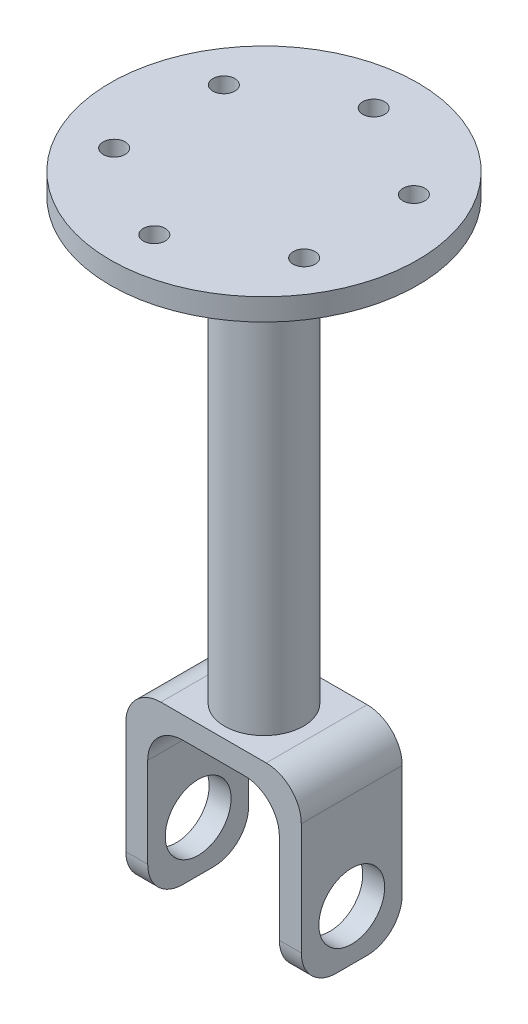
ISO-10303-21;
HEADER;
FILE_DESCRIPTION(('STEP AP214'),'2;1');
FILE_NAME('part.step','',(''),(''),'','','');
FILE_SCHEMA(('AUTOMOTIVE_DESIGN { 1 0 10303 214 1 1 1 1 }'));
ENDSEC;
DATA;
#1=APPLICATION_CONTEXT('core data for automotive mechanical design processes');
#2=APPLICATION_PROTOCOL_DEFINITION('international standard','automotive_design',2000,#1);
#3=PRODUCT_CONTEXT('',#1,'mechanical');
#4=PRODUCT('Part','Part','',(#3));
#5=PRODUCT_RELATED_PRODUCT_CATEGORY('part','',(#4));
#6=PRODUCT_DEFINITION_FORMATION('','',#4);
#7=PRODUCT_DEFINITION_CONTEXT('part definition',#1,'design');
#8=PRODUCT_DEFINITION('design','',#6,#7);
#9=PRODUCT_DEFINITION_SHAPE('','',#8);
#10=(LENGTH_UNIT() NAMED_UNIT(*) SI_UNIT(.MILLI.,.METRE.));
#11=(NAMED_UNIT(*) PLANE_ANGLE_UNIT() SI_UNIT($,.RADIAN.));
#12=(NAMED_UNIT(*) SI_UNIT($,.STERADIAN.) SOLID_ANGLE_UNIT());
#13=UNCERTAINTY_MEASURE_WITH_UNIT(LENGTH_MEASURE(1.E-05),#10,'distance_accuracy_value','');
#14=(GEOMETRIC_REPRESENTATION_CONTEXT(3) GLOBAL_UNCERTAINTY_ASSIGNED_CONTEXT((#13)) GLOBAL_UNIT_ASSIGNED_CONTEXT((#10,
#11,#12)) REPRESENTATION_CONTEXT('',''));
#15=CARTESIAN_POINT('',(0.,0.,0.));
#16=DIRECTION('',(0.,0.,1.));
#17=DIRECTION('',(1.,0.,0.));
#18=AXIS2_PLACEMENT_3D('',#15,#16,#17);
#19=CARTESIAN_POINT('',(20.,813.5,-11.5));
#20=DIRECTION('',(-1.,0.,0.));
#21=DIRECTION('',(0.,0.,1.));
#22=AXIS2_PLACEMENT_3D('',#19,#20,#21);
#23=PLANE('',#22);
#24=CARTESIAN_POINT('',(20.,825.,0.));
#25=DIRECTION('',(-1.,0.,0.));
#26=DIRECTION('',(0.,0.,1.));
#27=AXIS2_PLACEMENT_3D('',#24,#25,#26);
#28=CIRCLE('',#27,7.49999999999996);
#29=CARTESIAN_POINT('',(20.,825.,7.49999999999995));
#30=VERTEX_POINT('',#29);
#31=EDGE_CURVE('E344',#30,#30,#28,.T.);
#32=ORIENTED_EDGE('',*,*,#31,.T.);
#33=EDGE_LOOP('',(#32));
#34=FACE_BOUND('',#33,.T.);
#35=DIRECTION('',(0.,-1.,0.));
#36=VECTOR('',#35,1.);
#37=CARTESIAN_POINT('',(20.,813.5,-11.5));
#38=LINE('',#37,#36);
#39=CARTESIAN_POINT('',(20.,847.,-11.5));
#40=VERTEX_POINT('',#39);
#41=CARTESIAN_POINT('',(20.,821.5,-11.5));
#42=VERTEX_POINT('',#41);
#43=EDGE_CURVE('E174',#40,#42,#38,.T.);
#44=ORIENTED_EDGE('',*,*,#43,.F.);
#45=DIRECTION('',(0.,0.,1.));
#46=VECTOR('',#45,1.);
#47=CARTESIAN_POINT('',(20.,847.,-11.5));
#48=LINE('',#47,#46);
#49=CARTESIAN_POINT('',(20.,847.,11.5));
#50=VERTEX_POINT('',#49);
#51=EDGE_CURVE('E159',#40,#50,#48,.T.);
#52=ORIENTED_EDGE('',*,*,#51,.T.);
#53=DIRECTION('',(0.,-1.,0.));
#54=VECTOR('',#53,1.);
#55=CARTESIAN_POINT('',(20.,813.5,11.5));
#56=LINE('',#55,#54);
#57=CARTESIAN_POINT('',(20.,821.5,11.5));
#58=VERTEX_POINT('',#57);
#59=EDGE_CURVE('E171',#50,#58,#56,.T.);
#60=ORIENTED_EDGE('',*,*,#59,.T.);
#61=CARTESIAN_POINT('',(20.,821.5,3.5));
#62=DIRECTION('',(-1.,0.,0.));
#63=DIRECTION('',(0.,0.,1.));
#64=AXIS2_PLACEMENT_3D('',#61,#62,#63);
#65=CIRCLE('',#64,8.);
#66=CARTESIAN_POINT('',(20.,813.5,3.5));
#67=VERTEX_POINT('',#66);
#68=EDGE_CURVE('E176',#58,#67,#65,.F.);
#69=ORIENTED_EDGE('',*,*,#68,.T.);
#70=DIRECTION('',(0.,0.,1.));
#71=VECTOR('',#70,1.);
#72=CARTESIAN_POINT('',(20.,813.5,-11.5));
#73=LINE('',#72,#71);
#74=CARTESIAN_POINT('',(20.,813.5,-3.5));
#75=VERTEX_POINT('',#74);
#76=EDGE_CURVE('E212',#75,#67,#73,.T.);
#77=ORIENTED_EDGE('',*,*,#76,.F.);
#78=CARTESIAN_POINT('',(20.,821.5,-3.5));
#79=DIRECTION('',(-1.,0.,0.));
#80=DIRECTION('',(0.,0.,1.));
#81=AXIS2_PLACEMENT_3D('',#78,#79,#80);
#82=CIRCLE('',#81,8.);
#83=EDGE_CURVE('E216',#75,#42,#82,.F.);
#84=ORIENTED_EDGE('',*,*,#83,.T.);
#85=EDGE_LOOP('',(#44,#52,#60,#69,#77,#84));
#86=FACE_BOUND('',#85,.T.);
#87=ADVANCED_FACE('F41',(#34,#86),#23,.F.);
#88=CARTESIAN_POINT('',(20.,813.5,-11.5));
#89=DIRECTION('',(0.,1.,0.));
#90=DIRECTION('',(0.,0.,1.));
#91=AXIS2_PLACEMENT_3D('',#88,#89,#90);
#92=PLANE('',#91);
#93=ORIENTED_EDGE('',*,*,#76,.T.);
#94=DIRECTION('',(-1.,0.,0.));
#95=VECTOR('',#94,1.);
#96=CARTESIAN_POINT('',(15.,813.5,3.5));
#97=LINE('',#96,#95);
#98=CARTESIAN_POINT('',(15.,813.5,3.5));
#99=VERTEX_POINT('',#98);
#100=EDGE_CURVE('E256',#67,#99,#97,.T.);
#101=ORIENTED_EDGE('',*,*,#100,.T.);
#102=DIRECTION('',(0.,0.,1.));
#103=VECTOR('',#102,1.);
#104=CARTESIAN_POINT('',(15.,813.5,-11.5));
#105=LINE('',#104,#103);
#106=CARTESIAN_POINT('',(15.,813.5,-3.5));
#107=VERTEX_POINT('',#106);
#108=EDGE_CURVE('E209',#107,#99,#105,.T.);
#109=ORIENTED_EDGE('',*,*,#108,.F.);
#110=DIRECTION('',(-1.,0.,0.));
#111=VECTOR('',#110,1.);
#112=CARTESIAN_POINT('',(20.,813.5,-3.5));
#113=LINE('',#112,#111);
#114=EDGE_CURVE('E254',#107,#75,#113,.F.);
#115=ORIENTED_EDGE('',*,*,#114,.T.);
#116=EDGE_LOOP('',(#93,#101,#109,#115));
#117=FACE_BOUND('',#116,.T.);
#118=ADVANCED_FACE('F392',(#117),#92,.F.);
#119=CARTESIAN_POINT('',(15.,813.5,-11.5));
#120=DIRECTION('',(1.,0.,0.));
#121=DIRECTION('',(0.,0.,-1.));
#122=AXIS2_PLACEMENT_3D('',#119,#120,#121);
#123=PLANE('',#122);
#124=CARTESIAN_POINT('',(15.,825.,0.));
#125=DIRECTION('',(1.,0.,0.));
#126=DIRECTION('',(0.,0.,-1.));
#127=AXIS2_PLACEMENT_3D('',#124,#125,#126);
#128=CIRCLE('',#127,7.49999999999996);
#129=CARTESIAN_POINT('',(15.,825.,-7.49999999999996));
#130=VERTEX_POINT('',#129);
#131=EDGE_CURVE('E349',#130,#130,#128,.T.);
#132=ORIENTED_EDGE('',*,*,#131,.T.);
#133=EDGE_LOOP('',(#132));
#134=FACE_BOUND('',#133,.T.);
#135=DIRECTION('',(0.,1.,0.));
#136=VECTOR('',#135,1.);
#137=CARTESIAN_POINT('',(15.,813.5,11.5));
#138=LINE('',#137,#136);
#139=CARTESIAN_POINT('',(15.,821.5,11.5));
#140=VERTEX_POINT('',#139);
#141=CARTESIAN_POINT('',(15.,842.,11.5));
#142=VERTEX_POINT('',#141);
#143=EDGE_CURVE('E181',#140,#142,#138,.T.);
#144=ORIENTED_EDGE('',*,*,#143,.T.);
#145=DIRECTION('',(0.,0.,1.));
#146=VECTOR('',#145,1.);
#147=CARTESIAN_POINT('',(15.,842.,-11.5));
#148=LINE('',#147,#146);
#149=CARTESIAN_POINT('',(15.,842.,-11.5));
#150=VERTEX_POINT('',#149);
#151=EDGE_CURVE('E245',#142,#150,#148,.F.);
#152=ORIENTED_EDGE('',*,*,#151,.T.);
#153=DIRECTION('',(0.,1.,0.));
#154=VECTOR('',#153,1.);
#155=CARTESIAN_POINT('',(15.,813.5,-11.5));
#156=LINE('',#155,#154);
#157=CARTESIAN_POINT('',(15.,821.5,-11.5));
#158=VERTEX_POINT('',#157);
#159=EDGE_CURVE('E297',#158,#150,#156,.T.);
#160=ORIENTED_EDGE('',*,*,#159,.F.);
#161=CARTESIAN_POINT('',(15.,821.5,-3.5));
#162=DIRECTION('',(1.,0.,0.));
#163=DIRECTION('',(0.,0.,-1.));
#164=AXIS2_PLACEMENT_3D('',#161,#162,#163);
#165=CIRCLE('',#164,8.);
#166=EDGE_CURVE('E241',#158,#107,#165,.F.);
#167=ORIENTED_EDGE('',*,*,#166,.T.);
#168=ORIENTED_EDGE('',*,*,#108,.T.);
#169=CARTESIAN_POINT('',(15.,821.5,3.5));
#170=DIRECTION('',(1.,0.,0.));
#171=DIRECTION('',(0.,0.,-1.));
#172=AXIS2_PLACEMENT_3D('',#169,#170,#171);
#173=CIRCLE('',#172,8.);
#174=EDGE_CURVE('E243',#99,#140,#173,.F.);
#175=ORIENTED_EDGE('',*,*,#174,.T.);
#176=EDGE_LOOP('',(#144,#152,#160,#167,#168,#175));
#177=FACE_BOUND('',#176,.T.);
#178=ADVANCED_FACE('F399',(#134,#177),#123,.F.);
#179=CARTESIAN_POINT('',(15.,850.,-11.5));
#180=DIRECTION('',(0.,1.,0.));
#181=DIRECTION('',(0.,0.,1.));
#182=AXIS2_PLACEMENT_3D('',#179,#180,#181);
#183=PLANE('',#182);
#184=DIRECTION('',(-1.,0.,0.));
#185=VECTOR('',#184,1.);
#186=CARTESIAN_POINT('',(15.,850.,-11.5));
#187=LINE('',#186,#185);
#188=CARTESIAN_POINT('',(7.00000000000002,850.,-11.5));
#189=VERTEX_POINT('',#188);
#190=CARTESIAN_POINT('',(-6.99999999999997,850.,-11.5));
#191=VERTEX_POINT('',#190);
#192=EDGE_CURVE('E289',#189,#191,#187,.T.);
#193=ORIENTED_EDGE('',*,*,#192,.F.);
#194=DIRECTION('',(0.,0.,1.));
#195=VECTOR('',#194,1.);
#196=CARTESIAN_POINT('',(7.00000000000003,850.,11.5));
#197=LINE('',#196,#195);
#198=CARTESIAN_POINT('',(7.00000000000003,850.,11.5));
#199=VERTEX_POINT('',#198);
#200=EDGE_CURVE('E238',#189,#199,#197,.T.);
#201=ORIENTED_EDGE('',*,*,#200,.T.);
#202=DIRECTION('',(-1.,0.,0.));
#203=VECTOR('',#202,1.);
#204=CARTESIAN_POINT('',(15.,850.,11.5));
#205=LINE('',#204,#203);
#206=CARTESIAN_POINT('',(-6.99999999999997,850.,11.5));
#207=VERTEX_POINT('',#206);
#208=EDGE_CURVE('E185',#199,#207,#205,.T.);
#209=ORIENTED_EDGE('',*,*,#208,.T.);
#210=DIRECTION('',(0.,0.,1.));
#211=VECTOR('',#210,1.);
#212=CARTESIAN_POINT('',(-6.99999999999997,850.,-11.5));
#213=LINE('',#212,#211);
#214=EDGE_CURVE('E236',#207,#191,#213,.F.);
#215=ORIENTED_EDGE('',*,*,#214,.T.);
#216=EDGE_LOOP('',(#193,#201,#209,#215));
#217=FACE_BOUND('',#216,.T.);
#218=ADVANCED_FACE('F277',(#217),#183,.F.);
#219=CARTESIAN_POINT('',(-15.,850.,-11.5));
#220=DIRECTION('',(-1.,0.,0.));
#221=DIRECTION('',(0.,0.,1.));
#222=AXIS2_PLACEMENT_3D('',#219,#220,#221);
#223=PLANE('',#222);
#224=CARTESIAN_POINT('',(-15.,825.,0.));
#225=DIRECTION('',(-1.,0.,0.));
#226=DIRECTION('',(0.,0.,1.));
#227=AXIS2_PLACEMENT_3D('',#224,#225,#226);
#228=CIRCLE('',#227,7.49999999999996);
#229=CARTESIAN_POINT('',(-15.,825.,7.49999999999996));
#230=VERTEX_POINT('',#229);
#231=EDGE_CURVE('E352',#230,#230,#228,.T.);
#232=ORIENTED_EDGE('',*,*,#231,.T.);
#233=EDGE_LOOP('',(#232));
#234=FACE_BOUND('',#233,.T.);
#235=DIRECTION('',(0.,-1.,0.));
#236=VECTOR('',#235,1.);
#237=CARTESIAN_POINT('',(-15.,850.,-11.5));
#238=LINE('',#237,#236);
#239=CARTESIAN_POINT('',(-15.,842.,-11.5));
#240=VERTEX_POINT('',#239);
#241=CARTESIAN_POINT('',(-15.,821.5,-11.5));
#242=VERTEX_POINT('',#241);
#243=EDGE_CURVE('E287',#240,#242,#238,.T.);
#244=ORIENTED_EDGE('',*,*,#243,.F.);
#245=DIRECTION('',(0.,0.,1.));
#246=VECTOR('',#245,1.);
#247=CARTESIAN_POINT('',(-15.,842.,11.5));
#248=LINE('',#247,#246);
#249=CARTESIAN_POINT('',(-15.,842.,11.5));
#250=VERTEX_POINT('',#249);
#251=EDGE_CURVE('E251',#240,#250,#248,.T.);
#252=ORIENTED_EDGE('',*,*,#251,.T.);
#253=DIRECTION('',(0.,-1.,0.));
#254=VECTOR('',#253,1.);
#255=CARTESIAN_POINT('',(-15.,850.,11.5));
#256=LINE('',#255,#254);
#257=CARTESIAN_POINT('',(-15.,821.5,11.5));
#258=VERTEX_POINT('',#257);
#259=EDGE_CURVE('E196',#250,#258,#256,.T.);
#260=ORIENTED_EDGE('',*,*,#259,.T.);
#261=CARTESIAN_POINT('',(-15.,821.5,3.5));
#262=DIRECTION('',(-1.,0.,0.));
#263=DIRECTION('',(0.,0.,1.));
#264=AXIS2_PLACEMENT_3D('',#261,#262,#263);
#265=CIRCLE('',#264,8.);
#266=CARTESIAN_POINT('',(-15.,813.5,3.5));
#267=VERTEX_POINT('',#266);
#268=EDGE_CURVE('E249',#258,#267,#265,.F.);
#269=ORIENTED_EDGE('',*,*,#268,.T.);
#270=DIRECTION('',(0.,0.,1.));
#271=VECTOR('',#270,1.);
#272=CARTESIAN_POINT('',(-15.,813.5,-11.5));
#273=LINE('',#272,#271);
#274=CARTESIAN_POINT('',(-15.,813.5,-3.5));
#275=VERTEX_POINT('',#274);
#276=EDGE_CURVE('E206',#275,#267,#273,.T.);
#277=ORIENTED_EDGE('',*,*,#276,.F.);
#278=CARTESIAN_POINT('',(-15.,821.5,-3.5));
#279=DIRECTION('',(-1.,0.,0.));
#280=DIRECTION('',(0.,0.,1.));
#281=AXIS2_PLACEMENT_3D('',#278,#279,#280);
#282=CIRCLE('',#281,8.);
#283=EDGE_CURVE('E247',#275,#242,#282,.F.);
#284=ORIENTED_EDGE('',*,*,#283,.T.);
#285=EDGE_LOOP('',(#244,#252,#260,#269,#277,#284));
#286=FACE_BOUND('',#285,.T.);
#287=ADVANCED_FACE('F291',(#234,#286),#223,.F.);
#288=CARTESIAN_POINT('',(-15.,813.5,-11.5));
#289=DIRECTION('',(0.,1.,0.));
#290=DIRECTION('',(0.,0.,1.));
#291=AXIS2_PLACEMENT_3D('',#288,#289,#290);
#292=PLANE('',#291);
#293=ORIENTED_EDGE('',*,*,#276,.T.);
#294=DIRECTION('',(-1.,0.,0.));
#295=VECTOR('',#294,1.);
#296=CARTESIAN_POINT('',(-20.,813.5,3.5));
#297=LINE('',#296,#295);
#298=CARTESIAN_POINT('',(-20.,813.5,3.5));
#299=VERTEX_POINT('',#298);
#300=EDGE_CURVE('E261',#267,#299,#297,.T.);
#301=ORIENTED_EDGE('',*,*,#300,.T.);
#302=DIRECTION('',(0.,0.,1.));
#303=VECTOR('',#302,1.);
#304=CARTESIAN_POINT('',(-20.,813.5,-11.5));
#305=LINE('',#304,#303);
#306=CARTESIAN_POINT('',(-20.,813.5,-3.5));
#307=VERTEX_POINT('',#306);
#308=EDGE_CURVE('E204',#307,#299,#305,.T.);
#309=ORIENTED_EDGE('',*,*,#308,.F.);
#310=DIRECTION('',(-1.,0.,0.));
#311=VECTOR('',#310,1.);
#312=CARTESIAN_POINT('',(-15.,813.5,-3.5));
#313=LINE('',#312,#311);
#314=EDGE_CURVE('E259',#307,#275,#313,.F.);
#315=ORIENTED_EDGE('',*,*,#314,.T.);
#316=EDGE_LOOP('',(#293,#301,#309,#315));
#317=FACE_BOUND('',#316,.T.);
#318=ADVANCED_FACE('F365',(#317),#292,.F.);
#319=CARTESIAN_POINT('',(-20.,813.5,-11.5));
#320=DIRECTION('',(1.,0.,0.));
#321=DIRECTION('',(0.,0.,-1.));
#322=AXIS2_PLACEMENT_3D('',#319,#320,#321);
#323=PLANE('',#322);
#324=CARTESIAN_POINT('',(-19.9999999999999,825.,0.));
#325=DIRECTION('',(-1.,0.,0.));
#326=DIRECTION('',(0.,0.,1.));
#327=AXIS2_PLACEMENT_3D('',#324,#325,#326);
#328=CIRCLE('',#327,7.49999999999996);
#329=CARTESIAN_POINT('',(-19.9999999999999,825.,7.49999999999996));
#330=VERTEX_POINT('',#329);
#331=EDGE_CURVE('E355',#330,#330,#328,.T.);
#332=ORIENTED_EDGE('',*,*,#331,.F.);
#333=EDGE_LOOP('',(#332));
#334=FACE_BOUND('',#333,.T.);
#335=ORIENTED_EDGE('',*,*,#308,.T.);
#336=CARTESIAN_POINT('',(-20.,821.5,3.5));
#337=DIRECTION('',(1.,0.,0.));
#338=DIRECTION('',(0.,0.,-1.));
#339=AXIS2_PLACEMENT_3D('',#336,#337,#338);
#340=CIRCLE('',#339,8.);
#341=CARTESIAN_POINT('',(-20.,821.5,11.5));
#342=VERTEX_POINT('',#341);
#343=EDGE_CURVE('E56',#299,#342,#340,.F.);
#344=ORIENTED_EDGE('',*,*,#343,.T.);
#345=DIRECTION('',(0.,1.,0.));
#346=VECTOR('',#345,1.);
#347=CARTESIAN_POINT('',(-20.,813.5,11.5));
#348=LINE('',#347,#346);
#349=CARTESIAN_POINT('',(-20.,847.,11.5));
#350=VERTEX_POINT('',#349);
#351=EDGE_CURVE('E199',#342,#350,#348,.T.);
#352=ORIENTED_EDGE('',*,*,#351,.T.);
#353=DIRECTION('',(0.,0.,1.));
#354=VECTOR('',#353,1.);
#355=CARTESIAN_POINT('',(-20.,847.,-11.5));
#356=LINE('',#355,#354);
#357=CARTESIAN_POINT('',(-20.,847.,-11.5));
#358=VERTEX_POINT('',#357);
#359=EDGE_CURVE('E263',#350,#358,#356,.F.);
#360=ORIENTED_EDGE('',*,*,#359,.T.);
#361=DIRECTION('',(0.,1.,0.));
#362=VECTOR('',#361,1.);
#363=CARTESIAN_POINT('',(-20.,813.5,-11.5));
#364=LINE('',#363,#362);
#365=CARTESIAN_POINT('',(-20.,821.5,-11.5));
#366=VERTEX_POINT('',#365);
#367=EDGE_CURVE('E294',#366,#358,#364,.T.);
#368=ORIENTED_EDGE('',*,*,#367,.F.);
#369=CARTESIAN_POINT('',(-20.,821.5,-3.5));
#370=DIRECTION('',(1.,0.,0.));
#371=DIRECTION('',(0.,0.,-1.));
#372=AXIS2_PLACEMENT_3D('',#369,#370,#371);
#373=CIRCLE('',#372,8.);
#374=EDGE_CURVE('E64',#366,#307,#373,.F.);
#375=ORIENTED_EDGE('',*,*,#374,.T.);
#376=EDGE_LOOP('',(#335,#344,#352,#360,#368,#375));
#377=FACE_BOUND('',#376,.T.);
#378=ADVANCED_FACE('F362',(#334,#377),#323,.F.);
#379=CARTESIAN_POINT('',(20.,855.,-11.5));
#380=DIRECTION('',(0.,-1.,0.));
#381=DIRECTION('',(0.,0.,-1.));
#382=AXIS2_PLACEMENT_3D('',#379,#380,#381);
#383=PLANE('',#382);
#384=CARTESIAN_POINT('',(0.,855.,0.));
#385=DIRECTION('',(0.,1.,0.));
#386=DIRECTION('',(0.,0.,1.));
#387=AXIS2_PLACEMENT_3D('',#384,#385,#386);
#388=CIRCLE('',#387,9.);
#389=CARTESIAN_POINT('',(0.,855.,9.));
#390=VERTEX_POINT('',#389);
#391=EDGE_CURVE('E215',#390,#390,#388,.T.);
#392=ORIENTED_EDGE('',*,*,#391,.F.);
#393=EDGE_LOOP('',(#392));
#394=FACE_BOUND('',#393,.T.);
#395=DIRECTION('',(1.,0.,0.));
#396=VECTOR('',#395,1.);
#397=CARTESIAN_POINT('',(20.,855.,11.5));
#398=LINE('',#397,#396);
#399=CARTESIAN_POINT('',(-12.,855.,11.5));
#400=VERTEX_POINT('',#399);
#401=CARTESIAN_POINT('',(12.,855.,11.5));
#402=VERTEX_POINT('',#401);
#403=EDGE_CURVE('E202',#400,#402,#398,.T.);
#404=ORIENTED_EDGE('',*,*,#403,.T.);
#405=DIRECTION('',(0.,0.,1.));
#406=VECTOR('',#405,1.);
#407=CARTESIAN_POINT('',(12.,855.,-11.5));
#408=LINE('',#407,#406);
#409=CARTESIAN_POINT('',(12.,855.,-11.5));
#410=VERTEX_POINT('',#409);
#411=EDGE_CURVE('E160',#402,#410,#408,.F.);
#412=ORIENTED_EDGE('',*,*,#411,.T.);
#413=DIRECTION('',(1.,0.,0.));
#414=VECTOR('',#413,1.);
#415=CARTESIAN_POINT('',(20.,855.,-11.5));
#416=LINE('',#415,#414);
#417=CARTESIAN_POINT('',(-12.,855.,-11.5));
#418=VERTEX_POINT('',#417);
#419=EDGE_CURVE('E191',#418,#410,#416,.T.);
#420=ORIENTED_EDGE('',*,*,#419,.F.);
#421=DIRECTION('',(0.,0.,1.));
#422=VECTOR('',#421,1.);
#423=CARTESIAN_POINT('',(-12.,855.,-11.5));
#424=LINE('',#423,#422);
#425=EDGE_CURVE('E165',#418,#400,#424,.T.);
#426=ORIENTED_EDGE('',*,*,#425,.T.);
#427=EDGE_LOOP('',(#404,#412,#420,#426));
#428=FACE_BOUND('',#427,.T.);
#429=ADVANCED_FACE('F364',(#394,#428),#383,.F.);
#430=CARTESIAN_POINT('',(0.,0.,-11.5));
#431=DIRECTION('',(0.,0.,1.));
#432=DIRECTION('',(1.,0.,0.));
#433=AXIS2_PLACEMENT_3D('',#430,#431,#432);
#434=PLANE('',#433);
#435=ORIENTED_EDGE('',*,*,#419,.T.);
#436=CARTESIAN_POINT('',(12.,847.,-11.5));
#437=DIRECTION('',(0.,0.,1.));
#438=DIRECTION('',(1.,0.,0.));
#439=AXIS2_PLACEMENT_3D('',#436,#437,#438);
#440=CIRCLE('',#439,8.);
#441=EDGE_CURVE('E234',#410,#40,#440,.F.);
#442=ORIENTED_EDGE('',*,*,#441,.T.);
#443=ORIENTED_EDGE('',*,*,#43,.T.);
#444=DIRECTION('',(-1.,0.,0.));
#445=VECTOR('',#444,1.);
#446=CARTESIAN_POINT('',(0.,821.5,-11.5));
#447=LINE('',#446,#445);
#448=EDGE_CURVE('E231',#42,#158,#447,.T.);
#449=ORIENTED_EDGE('',*,*,#448,.T.);
#450=ORIENTED_EDGE('',*,*,#159,.T.);
#451=CARTESIAN_POINT('',(7.00000000000002,842.,-11.5));
#452=DIRECTION('',(0.,0.,1.));
#453=DIRECTION('',(1.,0.,0.));
#454=AXIS2_PLACEMENT_3D('',#451,#452,#453);
#455=CIRCLE('',#454,8.);
#456=EDGE_CURVE('E269',#150,#189,#455,.T.);
#457=ORIENTED_EDGE('',*,*,#456,.T.);
#458=ORIENTED_EDGE('',*,*,#192,.T.);
#459=CARTESIAN_POINT('',(-6.99999999999997,842.,-11.5));
#460=DIRECTION('',(0.,0.,1.));
#461=DIRECTION('',(1.,0.,0.));
#462=AXIS2_PLACEMENT_3D('',#459,#460,#461);
#463=CIRCLE('',#462,8.);
#464=EDGE_CURVE('E11',#191,#240,#463,.T.);
#465=ORIENTED_EDGE('',*,*,#464,.T.);
#466=ORIENTED_EDGE('',*,*,#243,.T.);
#467=DIRECTION('',(-1.,0.,0.));
#468=VECTOR('',#467,1.);
#469=CARTESIAN_POINT('',(0.,821.5,-11.5));
#470=LINE('',#469,#468);
#471=EDGE_CURVE('E228',#242,#366,#470,.T.);
#472=ORIENTED_EDGE('',*,*,#471,.T.);
#473=ORIENTED_EDGE('',*,*,#367,.T.);
#474=CARTESIAN_POINT('',(-12.,847.,-11.5));
#475=DIRECTION('',(0.,0.,1.));
#476=DIRECTION('',(1.,0.,0.));
#477=AXIS2_PLACEMENT_3D('',#474,#475,#476);
#478=CIRCLE('',#477,8.);
#479=EDGE_CURVE('E226',#358,#418,#478,.F.);
#480=ORIENTED_EDGE('',*,*,#479,.T.);
#481=EDGE_LOOP('',(#435,#442,#443,#449,#450,#457,#458,#465,#466,#472,#473,#480));
#482=FACE_BOUND('',#481,.T.);
#483=ADVANCED_FACE('F286',(#482),#434,.F.);
#484=CARTESIAN_POINT('',(0.,0.,11.5));
#485=DIRECTION('',(0.,0.,1.));
#486=DIRECTION('',(1.,0.,0.));
#487=AXIS2_PLACEMENT_3D('',#484,#485,#486);
#488=PLANE('',#487);
#489=ORIENTED_EDGE('',*,*,#59,.F.);
#490=CARTESIAN_POINT('',(12.,847.,11.5));
#491=DIRECTION('',(0.,0.,1.));
#492=DIRECTION('',(1.,0.,0.));
#493=AXIS2_PLACEMENT_3D('',#490,#491,#492);
#494=CIRCLE('',#493,8.);
#495=EDGE_CURVE('E155',#50,#402,#494,.T.);
#496=ORIENTED_EDGE('',*,*,#495,.T.);
#497=ORIENTED_EDGE('',*,*,#403,.F.);
#498=CARTESIAN_POINT('',(-12.,847.,11.5));
#499=DIRECTION('',(0.,0.,1.));
#500=DIRECTION('',(1.,0.,0.));
#501=AXIS2_PLACEMENT_3D('',#498,#499,#500);
#502=CIRCLE('',#501,8.);
#503=EDGE_CURVE('E175',#400,#350,#502,.T.);
#504=ORIENTED_EDGE('',*,*,#503,.T.);
#505=ORIENTED_EDGE('',*,*,#351,.F.);
#506=DIRECTION('',(-1.,0.,0.));
#507=VECTOR('',#506,1.);
#508=CARTESIAN_POINT('',(-15.,821.5,11.5));
#509=LINE('',#508,#507);
#510=EDGE_CURVE('E220',#342,#258,#509,.F.);
#511=ORIENTED_EDGE('',*,*,#510,.T.);
#512=ORIENTED_EDGE('',*,*,#259,.F.);
#513=CARTESIAN_POINT('',(-6.99999999999997,842.,11.5));
#514=DIRECTION('',(0.,0.,1.));
#515=DIRECTION('',(1.,0.,0.));
#516=AXIS2_PLACEMENT_3D('',#513,#514,#515);
#517=CIRCLE('',#516,8.);
#518=EDGE_CURVE('E49',#250,#207,#517,.F.);
#519=ORIENTED_EDGE('',*,*,#518,.T.);
#520=ORIENTED_EDGE('',*,*,#208,.F.);
#521=CARTESIAN_POINT('',(7.00000000000003,842.,11.5));
#522=DIRECTION('',(0.,0.,1.));
#523=DIRECTION('',(1.,0.,0.));
#524=AXIS2_PLACEMENT_3D('',#521,#522,#523);
#525=CIRCLE('',#524,8.);
#526=EDGE_CURVE('E267',#199,#142,#525,.F.);
#527=ORIENTED_EDGE('',*,*,#526,.T.);
#528=ORIENTED_EDGE('',*,*,#143,.F.);
#529=DIRECTION('',(-1.,0.,0.));
#530=VECTOR('',#529,1.);
#531=CARTESIAN_POINT('',(20.,821.5,11.5));
#532=LINE('',#531,#530);
#533=EDGE_CURVE('E166',#140,#58,#532,.F.);
#534=ORIENTED_EDGE('',*,*,#533,.T.);
#535=EDGE_LOOP('',(#489,#496,#497,#504,#505,#511,#512,#519,#520,#527,#528,#534));
#536=FACE_BOUND('',#535,.T.);
#537=ADVANCED_FACE('F178',(#536),#488,.T.);
#538=CARTESIAN_POINT('',(0.,955.,0.));
#539=DIRECTION('',(0.,-1.,0.));
#540=DIRECTION('',(0.,0.,-1.));
#541=AXIS2_PLACEMENT_3D('',#538,#539,#540);
#542=CYLINDRICAL_SURFACE('',#541,9.);
#543=CARTESIAN_POINT('',(0.,955.,0.));
#544=DIRECTION('',(0.,1.,0.));
#545=DIRECTION('',(0.,0.,1.));
#546=AXIS2_PLACEMENT_3D('',#543,#544,#545);
#547=CIRCLE('',#546,9.);
#548=CARTESIAN_POINT('',(0.,955.,9.));
#549=VERTEX_POINT('',#548);
#550=EDGE_CURVE('E182',#549,#549,#547,.T.);
#551=ORIENTED_EDGE('',*,*,#550,.F.);
#552=EDGE_LOOP('',(#551));
#553=FACE_BOUND('',#552,.T.);
#554=ORIENTED_EDGE('',*,*,#391,.T.);
#555=EDGE_LOOP('',(#554));
#556=FACE_BOUND('',#555,.T.);
#557=ADVANCED_FACE('F407',(#553,#556),#542,.T.);
#558=CARTESIAN_POINT('',(12.,847.,-11.5));
#559=DIRECTION('',(0.,0.,1.));
#560=DIRECTION('',(1.,0.,0.));
#561=AXIS2_PLACEMENT_3D('',#558,#559,#560);
#562=CYLINDRICAL_SURFACE('',#561,8.);
#563=ORIENTED_EDGE('',*,*,#441,.F.);
#564=ORIENTED_EDGE('',*,*,#411,.F.);
#565=ORIENTED_EDGE('',*,*,#495,.F.);
#566=ORIENTED_EDGE('',*,*,#51,.F.);
#567=EDGE_LOOP('',(#563,#564,#565,#566));
#568=FACE_BOUND('',#567,.T.);
#569=ADVANCED_FACE('F158',(#568),#562,.T.);
#570=CARTESIAN_POINT('',(7.00000000000002,842.,-11.5));
#571=DIRECTION('',(0.,0.,-1.));
#572=DIRECTION('',(-1.,0.,0.));
#573=AXIS2_PLACEMENT_3D('',#570,#571,#572);
#574=CYLINDRICAL_SURFACE('',#573,8.);
#575=ORIENTED_EDGE('',*,*,#456,.F.);
#576=ORIENTED_EDGE('',*,*,#151,.F.);
#577=ORIENTED_EDGE('',*,*,#526,.F.);
#578=ORIENTED_EDGE('',*,*,#200,.F.);
#579=EDGE_LOOP('',(#575,#576,#577,#578));
#580=FACE_BOUND('',#579,.T.);
#581=ADVANCED_FACE('F406',(#580),#574,.F.);
#582=CARTESIAN_POINT('',(-6.99999999999997,842.,-11.5));
#583=DIRECTION('',(0.,0.,-1.));
#584=DIRECTION('',(-1.,0.,0.));
#585=AXIS2_PLACEMENT_3D('',#582,#583,#584);
#586=CYLINDRICAL_SURFACE('',#585,8.);
#587=ORIENTED_EDGE('',*,*,#464,.F.);
#588=ORIENTED_EDGE('',*,*,#214,.F.);
#589=ORIENTED_EDGE('',*,*,#518,.F.);
#590=ORIENTED_EDGE('',*,*,#251,.F.);
#591=EDGE_LOOP('',(#587,#588,#589,#590));
#592=FACE_BOUND('',#591,.T.);
#593=ADVANCED_FACE('F281',(#592),#586,.F.);
#594=CARTESIAN_POINT('',(20.,821.5,3.5));
#595=DIRECTION('',(1.,0.,0.));
#596=DIRECTION('',(0.,0.,-1.));
#597=AXIS2_PLACEMENT_3D('',#594,#595,#596);
#598=CYLINDRICAL_SURFACE('',#597,8.);
#599=ORIENTED_EDGE('',*,*,#68,.F.);
#600=ORIENTED_EDGE('',*,*,#533,.F.);
#601=ORIENTED_EDGE('',*,*,#174,.F.);
#602=ORIENTED_EDGE('',*,*,#100,.F.);
#603=EDGE_LOOP('',(#599,#600,#601,#602));
#604=FACE_BOUND('',#603,.T.);
#605=ADVANCED_FACE('F388',(#604),#598,.T.);
#606=CARTESIAN_POINT('',(0.,821.5,-3.5));
#607=DIRECTION('',(-1.,0.,0.));
#608=DIRECTION('',(0.,0.,1.));
#609=AXIS2_PLACEMENT_3D('',#606,#607,#608);
#610=CYLINDRICAL_SURFACE('',#609,8.);
#611=ORIENTED_EDGE('',*,*,#83,.F.);
#612=ORIENTED_EDGE('',*,*,#114,.F.);
#613=ORIENTED_EDGE('',*,*,#166,.F.);
#614=ORIENTED_EDGE('',*,*,#448,.F.);
#615=EDGE_LOOP('',(#611,#612,#613,#614));
#616=FACE_BOUND('',#615,.T.);
#617=ADVANCED_FACE('F381',(#616),#610,.T.);
#618=CARTESIAN_POINT('',(-15.,821.5,3.5));
#619=DIRECTION('',(1.,0.,0.));
#620=DIRECTION('',(0.,0.,-1.));
#621=AXIS2_PLACEMENT_3D('',#618,#619,#620);
#622=CYLINDRICAL_SURFACE('',#621,8.);
#623=ORIENTED_EDGE('',*,*,#268,.F.);
#624=ORIENTED_EDGE('',*,*,#510,.F.);
#625=ORIENTED_EDGE('',*,*,#343,.F.);
#626=ORIENTED_EDGE('',*,*,#300,.F.);
#627=EDGE_LOOP('',(#623,#624,#625,#626));
#628=FACE_BOUND('',#627,.T.);
#629=ADVANCED_FACE('F379',(#628),#622,.T.);
#630=CARTESIAN_POINT('',(0.,821.5,-3.5));
#631=DIRECTION('',(-1.,0.,0.));
#632=DIRECTION('',(0.,0.,1.));
#633=AXIS2_PLACEMENT_3D('',#630,#631,#632);
#634=CYLINDRICAL_SURFACE('',#633,8.);
#635=ORIENTED_EDGE('',*,*,#283,.F.);
#636=ORIENTED_EDGE('',*,*,#314,.F.);
#637=ORIENTED_EDGE('',*,*,#374,.F.);
#638=ORIENTED_EDGE('',*,*,#471,.F.);
#639=EDGE_LOOP('',(#635,#636,#637,#638));
#640=FACE_BOUND('',#639,.T.);
#641=ADVANCED_FACE('F371',(#640),#634,.T.);
#642=CARTESIAN_POINT('',(-12.,847.,-11.5));
#643=DIRECTION('',(0.,0.,1.));
#644=DIRECTION('',(1.,0.,0.));
#645=AXIS2_PLACEMENT_3D('',#642,#643,#644);
#646=CYLINDRICAL_SURFACE('',#645,8.);
#647=ORIENTED_EDGE('',*,*,#479,.F.);
#648=ORIENTED_EDGE('',*,*,#359,.F.);
#649=ORIENTED_EDGE('',*,*,#503,.F.);
#650=ORIENTED_EDGE('',*,*,#425,.F.);
#651=EDGE_LOOP('',(#647,#648,#649,#650));
#652=FACE_BOUND('',#651,.T.);
#653=ADVANCED_FACE('F43',(#652),#646,.T.);
#654=CARTESIAN_POINT('',(0.,960.,0.));
#655=DIRECTION('',(0.,1.,0.));
#656=DIRECTION('',(0.,0.,1.));
#657=AXIS2_PLACEMENT_3D('',#654,#655,#656);
#658=PLANE('',#657);
#659=CARTESIAN_POINT('',(-21.6506350946111,960.,12.4999999999998));
#660=DIRECTION('',(0.,1.,0.));
#661=DIRECTION('',(0.,0.,1.));
#662=AXIS2_PLACEMENT_3D('',#659,#660,#661);
#663=CIRCLE('',#662,2.5);
#664=CARTESIAN_POINT('',(-21.6506350946111,960.,14.9999999999998));
#665=VERTEX_POINT('',#664);
#666=EDGE_CURVE('E332',#665,#665,#663,.T.);
#667=ORIENTED_EDGE('',*,*,#666,.F.);
#668=EDGE_LOOP('',(#667));
#669=FACE_BOUND('',#668,.T.);
#670=CARTESIAN_POINT('',(21.6506350946109,960.,12.5000000000001));
#671=DIRECTION('',(0.,1.,0.));
#672=DIRECTION('',(0.,0.,1.));
#673=AXIS2_PLACEMENT_3D('',#670,#671,#672);
#674=CIRCLE('',#673,2.5);
#675=CARTESIAN_POINT('',(21.6506350946109,960.,15.0000000000001));
#676=VERTEX_POINT('',#675);
#677=EDGE_CURVE('E320',#676,#676,#674,.T.);
#678=ORIENTED_EDGE('',*,*,#677,.F.);
#679=EDGE_LOOP('',(#678));
#680=FACE_BOUND('',#679,.T.);
#681=CARTESIAN_POINT('',(0.,960.,-25.));
#682=DIRECTION('',(0.,1.,0.));
#683=DIRECTION('',(0.,0.,1.));
#684=AXIS2_PLACEMENT_3D('',#681,#682,#683);
#685=CIRCLE('',#684,2.5);
#686=CARTESIAN_POINT('',(0.,960.,-22.5));
#687=VERTEX_POINT('',#686);
#688=EDGE_CURVE('E308',#687,#687,#685,.T.);
#689=ORIENTED_EDGE('',*,*,#688,.F.);
#690=EDGE_LOOP('',(#689));
#691=FACE_BOUND('',#690,.T.);
#692=CARTESIAN_POINT('',(0.,960.,0.));
#693=DIRECTION('',(0.,1.,0.));
#694=DIRECTION('',(0.,0.,1.));
#695=AXIS2_PLACEMENT_3D('',#692,#693,#694);
#696=CIRCLE('',#695,35.);
#697=CARTESIAN_POINT('',(0.,960.,35.));
#698=VERTEX_POINT('',#697);
#699=EDGE_CURVE('E188',#698,#698,#696,.T.);
#700=ORIENTED_EDGE('',*,*,#699,.T.);
#701=EDGE_LOOP('',(#700));
#702=FACE_BOUND('',#701,.T.);
#703=CARTESIAN_POINT('',(21.650635094611,960.,-12.5));
#704=DIRECTION('',(0.,1.,0.));
#705=DIRECTION('',(0.,0.,1.));
#706=AXIS2_PLACEMENT_3D('',#703,#704,#705);
#707=CIRCLE('',#706,2.5);
#708=CARTESIAN_POINT('',(21.650635094611,960.,-9.99999999999995));
#709=VERTEX_POINT('',#708);
#710=EDGE_CURVE('E314',#709,#709,#707,.T.);
#711=ORIENTED_EDGE('',*,*,#710,.F.);
#712=EDGE_LOOP('',(#711));
#713=FACE_BOUND('',#712,.T.);
#714=CARTESIAN_POINT('',(-1.74574066942157E-13,960.,25.));
#715=DIRECTION('',(0.,1.,0.));
#716=DIRECTION('',(0.,0.,1.));
#717=AXIS2_PLACEMENT_3D('',#714,#715,#716);
#718=CIRCLE('',#717,2.5);
#719=CARTESIAN_POINT('',(-1.74574066942157E-13,960.,27.5));
#720=VERTEX_POINT('',#719);
#721=EDGE_CURVE('E326',#720,#720,#718,.T.);
#722=ORIENTED_EDGE('',*,*,#721,.F.);
#723=EDGE_LOOP('',(#722));
#724=FACE_BOUND('',#723,.T.);
#725=CARTESIAN_POINT('',(-21.6506350946108,960.,-12.5000000000003));
#726=DIRECTION('',(0.,1.,0.));
#727=DIRECTION('',(0.,0.,1.));
#728=AXIS2_PLACEMENT_3D('',#725,#726,#727);
#729=CIRCLE('',#728,2.5);
#730=CARTESIAN_POINT('',(-21.6506350946108,960.,-10.0000000000003));
#731=VERTEX_POINT('',#730);
#732=EDGE_CURVE('E338',#731,#731,#729,.T.);
#733=ORIENTED_EDGE('',*,*,#732,.F.);
#734=EDGE_LOOP('',(#733));
#735=FACE_BOUND('',#734,.T.);
#736=ADVANCED_FACE('F459',(#669,#680,#691,#702,#713,#724,#735),#658,.T.);
#737=CARTESIAN_POINT('',(0.,955.,0.));
#738=DIRECTION('',(0.,1.,0.));
#739=DIRECTION('',(0.,0.,1.));
#740=AXIS2_PLACEMENT_3D('',#737,#738,#739);
#741=PLANE('',#740);
#742=ORIENTED_EDGE('',*,*,#550,.T.);
#743=EDGE_LOOP('',(#742));
#744=FACE_BOUND('',#743,.T.);
#745=CARTESIAN_POINT('',(0.,955.,0.));
#746=DIRECTION('',(0.,1.,0.));
#747=DIRECTION('',(0.,0.,1.));
#748=AXIS2_PLACEMENT_3D('',#745,#746,#747);
#749=CIRCLE('',#748,35.);
#750=CARTESIAN_POINT('',(0.,955.,35.));
#751=VERTEX_POINT('',#750);
#752=EDGE_CURVE('E305',#751,#751,#749,.T.);
#753=ORIENTED_EDGE('',*,*,#752,.F.);
#754=EDGE_LOOP('',(#753));
#755=FACE_BOUND('',#754,.T.);
#756=CARTESIAN_POINT('',(0.,955.,-25.));
#757=DIRECTION('',(0.,1.,0.));
#758=DIRECTION('',(0.,0.,1.));
#759=AXIS2_PLACEMENT_3D('',#756,#757,#758);
#760=CIRCLE('',#759,2.5);
#761=CARTESIAN_POINT('',(0.,955.,-22.5));
#762=VERTEX_POINT('',#761);
#763=EDGE_CURVE('E311',#762,#762,#760,.T.);
#764=ORIENTED_EDGE('',*,*,#763,.T.);
#765=EDGE_LOOP('',(#764));
#766=FACE_BOUND('',#765,.T.);
#767=CARTESIAN_POINT('',(21.650635094611,955.,-12.5));
#768=DIRECTION('',(0.,1.,0.));
#769=DIRECTION('',(0.,0.,1.));
#770=AXIS2_PLACEMENT_3D('',#767,#768,#769);
#771=CIRCLE('',#770,2.5);
#772=CARTESIAN_POINT('',(21.650635094611,955.,-9.99999999999995));
#773=VERTEX_POINT('',#772);
#774=EDGE_CURVE('E317',#773,#773,#771,.T.);
#775=ORIENTED_EDGE('',*,*,#774,.T.);
#776=EDGE_LOOP('',(#775));
#777=FACE_BOUND('',#776,.T.);
#778=CARTESIAN_POINT('',(21.6506350946109,955.,12.5000000000001));
#779=DIRECTION('',(0.,1.,0.));
#780=DIRECTION('',(0.,0.,1.));
#781=AXIS2_PLACEMENT_3D('',#778,#779,#780);
#782=CIRCLE('',#781,2.5);
#783=CARTESIAN_POINT('',(21.6506350946109,955.,15.0000000000001));
#784=VERTEX_POINT('',#783);
#785=EDGE_CURVE('E323',#784,#784,#782,.T.);
#786=ORIENTED_EDGE('',*,*,#785,.T.);
#787=EDGE_LOOP('',(#786));
#788=FACE_BOUND('',#787,.T.);
#789=CARTESIAN_POINT('',(-1.74574066942157E-13,955.,25.));
#790=DIRECTION('',(0.,1.,0.));
#791=DIRECTION('',(0.,0.,1.));
#792=AXIS2_PLACEMENT_3D('',#789,#790,#791);
#793=CIRCLE('',#792,2.5);
#794=CARTESIAN_POINT('',(-1.74574066942157E-13,955.,27.5));
#795=VERTEX_POINT('',#794);
#796=EDGE_CURVE('E329',#795,#795,#793,.T.);
#797=ORIENTED_EDGE('',*,*,#796,.T.);
#798=EDGE_LOOP('',(#797));
#799=FACE_BOUND('',#798,.T.);
#800=CARTESIAN_POINT('',(-21.6506350946111,955.,12.4999999999998));
#801=DIRECTION('',(0.,1.,0.));
#802=DIRECTION('',(0.,0.,1.));
#803=AXIS2_PLACEMENT_3D('',#800,#801,#802);
#804=CIRCLE('',#803,2.5);
#805=CARTESIAN_POINT('',(-21.6506350946111,955.,14.9999999999998));
#806=VERTEX_POINT('',#805);
#807=EDGE_CURVE('E335',#806,#806,#804,.T.);
#808=ORIENTED_EDGE('',*,*,#807,.T.);
#809=EDGE_LOOP('',(#808));
#810=FACE_BOUND('',#809,.T.);
#811=CARTESIAN_POINT('',(-21.6506350946108,955.,-12.5000000000003));
#812=DIRECTION('',(0.,1.,0.));
#813=DIRECTION('',(0.,0.,1.));
#814=AXIS2_PLACEMENT_3D('',#811,#812,#813);
#815=CIRCLE('',#814,2.5);
#816=CARTESIAN_POINT('',(-21.6506350946108,955.,-10.0000000000003));
#817=VERTEX_POINT('',#816);
#818=EDGE_CURVE('E341',#817,#817,#815,.T.);
#819=ORIENTED_EDGE('',*,*,#818,.T.);
#820=EDGE_LOOP('',(#819));
#821=FACE_BOUND('',#820,.T.);
#822=ADVANCED_FACE('F455',(#744,#755,#766,#777,#788,#799,#810,#821),#741,.F.);
#823=CARTESIAN_POINT('',(0.,960.,0.));
#824=DIRECTION('',(0.,-1.,0.));
#825=DIRECTION('',(0.,0.,-1.));
#826=AXIS2_PLACEMENT_3D('',#823,#824,#825);
#827=CYLINDRICAL_SURFACE('',#826,35.);
#828=ORIENTED_EDGE('',*,*,#699,.F.);
#829=EDGE_LOOP('',(#828));
#830=FACE_BOUND('',#829,.T.);
#831=ORIENTED_EDGE('',*,*,#752,.T.);
#832=EDGE_LOOP('',(#831));
#833=FACE_BOUND('',#832,.T.);
#834=ADVANCED_FACE('F451',(#830,#833),#827,.T.);
#835=CARTESIAN_POINT('',(0.,960.,-25.));
#836=DIRECTION('',(0.,-1.,0.));
#837=DIRECTION('',(0.,0.,-1.));
#838=AXIS2_PLACEMENT_3D('',#835,#836,#837);
#839=CYLINDRICAL_SURFACE('',#838,2.5);
#840=ORIENTED_EDGE('',*,*,#688,.T.);
#841=EDGE_LOOP('',(#840));
#842=FACE_BOUND('',#841,.T.);
#843=ORIENTED_EDGE('',*,*,#763,.F.);
#844=EDGE_LOOP('',(#843));
#845=FACE_BOUND('',#844,.T.);
#846=ADVANCED_FACE('F454',(#842,#845),#839,.F.);
#847=CARTESIAN_POINT('',(21.650635094611,960.,-12.5));
#848=DIRECTION('',(0.,-1.,0.));
#849=DIRECTION('',(0.,0.,-1.));
#850=AXIS2_PLACEMENT_3D('',#847,#848,#849);
#851=CYLINDRICAL_SURFACE('',#850,2.5);
#852=ORIENTED_EDGE('',*,*,#710,.T.);
#853=EDGE_LOOP('',(#852));
#854=FACE_BOUND('',#853,.T.);
#855=ORIENTED_EDGE('',*,*,#774,.F.);
#856=EDGE_LOOP('',(#855));
#857=FACE_BOUND('',#856,.T.);
#858=ADVANCED_FACE('F466',(#854,#857),#851,.F.);
#859=CARTESIAN_POINT('',(21.6506350946109,960.,12.5000000000001));
#860=DIRECTION('',(0.,-1.,0.));
#861=DIRECTION('',(0.,0.,-1.));
#862=AXIS2_PLACEMENT_3D('',#859,#860,#861);
#863=CYLINDRICAL_SURFACE('',#862,2.5);
#864=ORIENTED_EDGE('',*,*,#677,.T.);
#865=EDGE_LOOP('',(#864));
#866=FACE_BOUND('',#865,.T.);
#867=ORIENTED_EDGE('',*,*,#785,.F.);
#868=EDGE_LOOP('',(#867));
#869=FACE_BOUND('',#868,.T.);
#870=ADVANCED_FACE('F470',(#866,#869),#863,.F.);
#871=CARTESIAN_POINT('',(-1.74574066942157E-13,960.,25.));
#872=DIRECTION('',(0.,-1.,0.));
#873=DIRECTION('',(0.,0.,-1.));
#874=AXIS2_PLACEMENT_3D('',#871,#872,#873);
#875=CYLINDRICAL_SURFACE('',#874,2.5);
#876=ORIENTED_EDGE('',*,*,#721,.T.);
#877=EDGE_LOOP('',(#876));
#878=FACE_BOUND('',#877,.T.);
#879=ORIENTED_EDGE('',*,*,#796,.F.);
#880=EDGE_LOOP('',(#879));
#881=FACE_BOUND('',#880,.T.);
#882=ADVANCED_FACE('F474',(#878,#881),#875,.F.);
#883=CARTESIAN_POINT('',(-21.6506350946111,960.,12.4999999999998));
#884=DIRECTION('',(0.,-1.,0.));
#885=DIRECTION('',(0.,0.,-1.));
#886=AXIS2_PLACEMENT_3D('',#883,#884,#885);
#887=CYLINDRICAL_SURFACE('',#886,2.5);
#888=ORIENTED_EDGE('',*,*,#666,.T.);
#889=EDGE_LOOP('',(#888));
#890=FACE_BOUND('',#889,.T.);
#891=ORIENTED_EDGE('',*,*,#807,.F.);
#892=EDGE_LOOP('',(#891));
#893=FACE_BOUND('',#892,.T.);
#894=ADVANCED_FACE('F478',(#890,#893),#887,.F.);
#895=CARTESIAN_POINT('',(-21.6506350946108,960.,-12.5000000000003));
#896=DIRECTION('',(0.,-1.,0.));
#897=DIRECTION('',(0.,0.,-1.));
#898=AXIS2_PLACEMENT_3D('',#895,#896,#897);
#899=CYLINDRICAL_SURFACE('',#898,2.5);
#900=ORIENTED_EDGE('',*,*,#732,.T.);
#901=EDGE_LOOP('',(#900));
#902=FACE_BOUND('',#901,.T.);
#903=ORIENTED_EDGE('',*,*,#818,.F.);
#904=EDGE_LOOP('',(#903));
#905=FACE_BOUND('',#904,.T.);
#906=ADVANCED_FACE('F482',(#902,#905),#899,.F.);
#907=CARTESIAN_POINT('',(35.,825.,0.));
#908=DIRECTION('',(-1.,0.,0.));
#909=DIRECTION('',(0.,0.,1.));
#910=AXIS2_PLACEMENT_3D('',#907,#908,#909);
#911=CYLINDRICAL_SURFACE('',#910,7.49999999999996);
#912=ORIENTED_EDGE('',*,*,#331,.T.);
#913=EDGE_LOOP('',(#912));
#914=FACE_BOUND('',#913,.T.);
#915=ORIENTED_EDGE('',*,*,#231,.F.);
#916=EDGE_LOOP('',(#915));
#917=FACE_BOUND('',#916,.T.);
#918=ADVANCED_FACE('F359',(#914,#917),#911,.F.);
#919=ORIENTED_EDGE('',*,*,#131,.F.);
#920=EDGE_LOOP('',(#919));
#921=FACE_BOUND('',#920,.T.);
#922=ORIENTED_EDGE('',*,*,#31,.F.);
#923=EDGE_LOOP('',(#922));
#924=FACE_BOUND('',#923,.T.);
#925=ADVANCED_FACE('F487',(#921,#924),#911,.F.);
#926=CLOSED_SHELL('',(#87,#118,#178,#218,#287,#318,#378,#429,#483,#537,#557,#569,#581,#593,#605,
#617,#629,#641,#653,#736,#822,#834,#846,#858,#870,#882,#894,#906,#918,#925));
#927=MANIFOLD_SOLID_BREP('B2',#926);
#928=ADVANCED_BREP_SHAPE_REPRESENTATION('',(#18,#927),#14);
#929=SHAPE_DEFINITION_REPRESENTATION(#9,#928);
ENDSEC;
END-ISO-10303-21;
